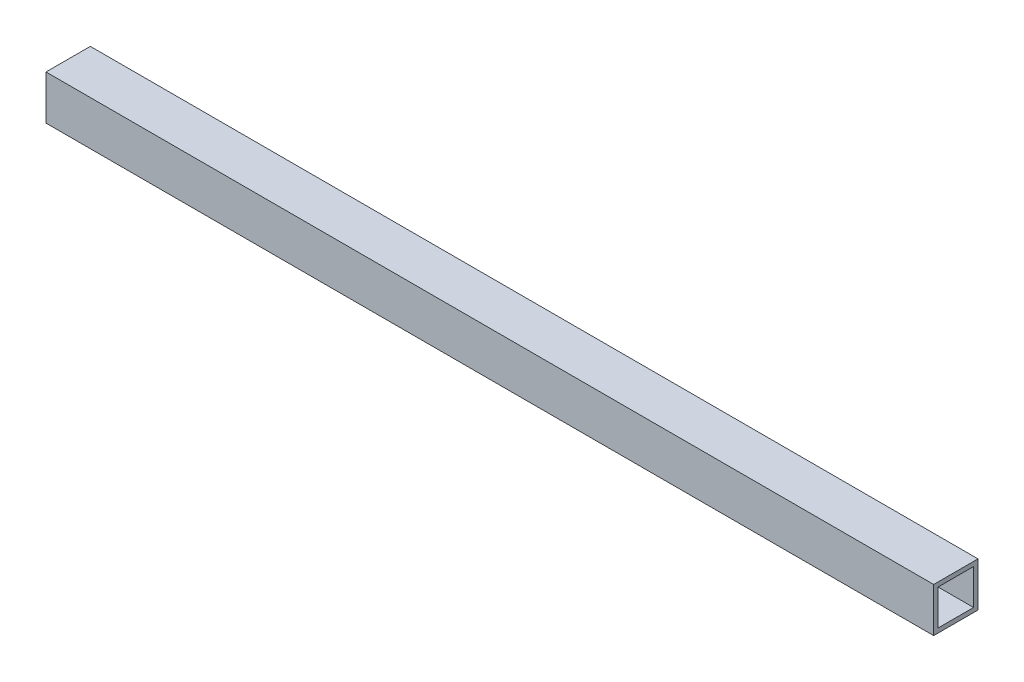
ISO-10303-21;
HEADER;
FILE_DESCRIPTION(('STEP AP214'),'2;1');
FILE_NAME('part.step','',(''),(''),'','','');
FILE_SCHEMA(('AUTOMOTIVE_DESIGN { 1 0 10303 214 1 1 1 1 }'));
ENDSEC;
DATA;
#1=APPLICATION_CONTEXT('core data for automotive mechanical design processes');
#2=APPLICATION_PROTOCOL_DEFINITION('international standard','automotive_design',2000,#1);
#3=PRODUCT_CONTEXT('',#1,'mechanical');
#4=PRODUCT('Part','Part','',(#3));
#5=PRODUCT_RELATED_PRODUCT_CATEGORY('part','',(#4));
#6=PRODUCT_DEFINITION_FORMATION('','',#4);
#7=PRODUCT_DEFINITION_CONTEXT('part definition',#1,'design');
#8=PRODUCT_DEFINITION('design','',#6,#7);
#9=PRODUCT_DEFINITION_SHAPE('','',#8);
#10=(LENGTH_UNIT() NAMED_UNIT(*) SI_UNIT(.MILLI.,.METRE.));
#11=(NAMED_UNIT(*) PLANE_ANGLE_UNIT() SI_UNIT($,.RADIAN.));
#12=(NAMED_UNIT(*) SI_UNIT($,.STERADIAN.) SOLID_ANGLE_UNIT());
#13=UNCERTAINTY_MEASURE_WITH_UNIT(LENGTH_MEASURE(1.E-05),#10,'distance_accuracy_value','');
#14=(GEOMETRIC_REPRESENTATION_CONTEXT(3) GLOBAL_UNCERTAINTY_ASSIGNED_CONTEXT((#13)) GLOBAL_UNIT_ASSIGNED_CONTEXT((#10,
#11,#12)) REPRESENTATION_CONTEXT('',''));
#15=CARTESIAN_POINT('',(0.,0.,0.));
#16=DIRECTION('',(0.,0.,1.));
#17=DIRECTION('',(1.,0.,0.));
#18=AXIS2_PLACEMENT_3D('',#15,#16,#17);
#19=CARTESIAN_POINT('',(400.5,-10.,-10.));
#20=DIRECTION('',(0.,1.,0.));
#21=DIRECTION('',(0.,0.,1.));
#22=AXIS2_PLACEMENT_3D('',#19,#20,#21);
#23=PLANE('',#22);
#24=DIRECTION('',(0.,0.,-1.));
#25=VECTOR('',#24,1.);
#26=CARTESIAN_POINT('',(0.,-10.,-10.));
#27=LINE('',#26,#25);
#28=CARTESIAN_POINT('',(0.,-10.,10.));
#29=VERTEX_POINT('',#28);
#30=CARTESIAN_POINT('',(0.,-10.,-10.));
#31=VERTEX_POINT('',#30);
#32=EDGE_CURVE('E157',#29,#31,#27,.T.);
#33=ORIENTED_EDGE('',*,*,#32,.T.);
#34=DIRECTION('',(-1.,0.,0.));
#35=VECTOR('',#34,1.);
#36=CARTESIAN_POINT('',(400.5,-10.,-10.));
#37=LINE('',#36,#35);
#38=CARTESIAN_POINT('',(400.5,-10.,-10.));
#39=VERTEX_POINT('',#38);
#40=EDGE_CURVE('E12',#39,#31,#37,.T.);
#41=ORIENTED_EDGE('',*,*,#40,.F.);
#42=DIRECTION('',(0.,0.,-1.));
#43=VECTOR('',#42,1.);
#44=CARTESIAN_POINT('',(400.5,-10.,-10.));
#45=LINE('',#44,#43);
#46=CARTESIAN_POINT('',(400.5,-10.,10.));
#47=VERTEX_POINT('',#46);
#48=EDGE_CURVE('E131',#47,#39,#45,.T.);
#49=ORIENTED_EDGE('',*,*,#48,.F.);
#50=DIRECTION('',(-1.,0.,0.));
#51=VECTOR('',#50,1.);
#52=CARTESIAN_POINT('',(400.5,-10.,10.));
#53=LINE('',#52,#51);
#54=EDGE_CURVE('E164',#47,#29,#53,.T.);
#55=ORIENTED_EDGE('',*,*,#54,.T.);
#56=EDGE_LOOP('',(#33,#41,#49,#55));
#57=FACE_BOUND('',#56,.T.);
#58=ADVANCED_FACE('F50',(#57),#23,.F.);
#59=CARTESIAN_POINT('',(400.5,10.,-10.));
#60=DIRECTION('',(0.,0.,1.));
#61=DIRECTION('',(1.,0.,0.));
#62=AXIS2_PLACEMENT_3D('',#59,#60,#61);
#63=PLANE('',#62);
#64=DIRECTION('',(0.,1.,0.));
#65=VECTOR('',#64,1.);
#66=CARTESIAN_POINT('',(0.,10.,-10.));
#67=LINE('',#66,#65);
#68=CARTESIAN_POINT('',(0.,10.,-10.));
#69=VERTEX_POINT('',#68);
#70=EDGE_CURVE('E136',#31,#69,#67,.T.);
#71=ORIENTED_EDGE('',*,*,#70,.T.);
#72=DIRECTION('',(-1.,0.,0.));
#73=VECTOR('',#72,1.);
#74=CARTESIAN_POINT('',(400.5,10.,-10.));
#75=LINE('',#74,#73);
#76=CARTESIAN_POINT('',(400.5,10.,-10.));
#77=VERTEX_POINT('',#76);
#78=EDGE_CURVE('E60',#77,#69,#75,.T.);
#79=ORIENTED_EDGE('',*,*,#78,.F.);
#80=DIRECTION('',(0.,1.,0.));
#81=VECTOR('',#80,1.);
#82=CARTESIAN_POINT('',(400.5,10.,-10.));
#83=LINE('',#82,#81);
#84=EDGE_CURVE('E125',#39,#77,#83,.T.);
#85=ORIENTED_EDGE('',*,*,#84,.F.);
#86=ORIENTED_EDGE('',*,*,#40,.T.);
#87=EDGE_LOOP('',(#71,#79,#85,#86));
#88=FACE_BOUND('',#87,.T.);
#89=ADVANCED_FACE('F135',(#88),#63,.F.);
#90=CARTESIAN_POINT('',(400.5,10.,-10.));
#91=DIRECTION('',(0.,-1.,0.));
#92=DIRECTION('',(0.,0.,-1.));
#93=AXIS2_PLACEMENT_3D('',#90,#91,#92);
#94=PLANE('',#93);
#95=DIRECTION('',(0.,0.,1.));
#96=VECTOR('',#95,1.);
#97=CARTESIAN_POINT('',(0.,10.,-10.));
#98=LINE('',#97,#96);
#99=CARTESIAN_POINT('',(0.,10.,10.));
#100=VERTEX_POINT('',#99);
#101=EDGE_CURVE('E98',#69,#100,#98,.T.);
#102=ORIENTED_EDGE('',*,*,#101,.T.);
#103=DIRECTION('',(-1.,0.,0.));
#104=VECTOR('',#103,1.);
#105=CARTESIAN_POINT('',(400.5,10.,10.));
#106=LINE('',#105,#104);
#107=CARTESIAN_POINT('',(400.5,10.,10.));
#108=VERTEX_POINT('',#107);
#109=EDGE_CURVE('E137',#108,#100,#106,.T.);
#110=ORIENTED_EDGE('',*,*,#109,.F.);
#111=DIRECTION('',(0.,0.,1.));
#112=VECTOR('',#111,1.);
#113=CARTESIAN_POINT('',(400.5,10.,-10.));
#114=LINE('',#113,#112);
#115=EDGE_CURVE('E129',#77,#108,#114,.T.);
#116=ORIENTED_EDGE('',*,*,#115,.F.);
#117=ORIENTED_EDGE('',*,*,#78,.T.);
#118=EDGE_LOOP('',(#102,#110,#116,#117));
#119=FACE_BOUND('',#118,.T.);
#120=ADVANCED_FACE('F139',(#119),#94,.F.);
#121=CARTESIAN_POINT('',(400.5,-8.,-8.));
#122=DIRECTION('',(0.,1.,0.));
#123=DIRECTION('',(0.,0.,1.));
#124=AXIS2_PLACEMENT_3D('',#121,#122,#123);
#125=PLANE('',#124);
#126=DIRECTION('',(0.,0.,-1.));
#127=VECTOR('',#126,1.);
#128=CARTESIAN_POINT('',(0.,-8.,-8.));
#129=LINE('',#128,#127);
#130=CARTESIAN_POINT('',(0.,-8.,8.));
#131=VERTEX_POINT('',#130);
#132=CARTESIAN_POINT('',(0.,-8.,-8.));
#133=VERTEX_POINT('',#132);
#134=EDGE_CURVE('E145',#131,#133,#129,.T.);
#135=ORIENTED_EDGE('',*,*,#134,.F.);
#136=DIRECTION('',(-1.,0.,0.));
#137=VECTOR('',#136,1.);
#138=CARTESIAN_POINT('',(400.5,-8.,8.));
#139=LINE('',#138,#137);
#140=CARTESIAN_POINT('',(400.5,-8.,8.));
#141=VERTEX_POINT('',#140);
#142=EDGE_CURVE('E54',#141,#131,#139,.T.);
#143=ORIENTED_EDGE('',*,*,#142,.F.);
#144=DIRECTION('',(0.,0.,-1.));
#145=VECTOR('',#144,1.);
#146=CARTESIAN_POINT('',(400.5,-8.,-8.));
#147=LINE('',#146,#145);
#148=CARTESIAN_POINT('',(400.5,-8.,-8.));
#149=VERTEX_POINT('',#148);
#150=EDGE_CURVE('E163',#141,#149,#147,.T.);
#151=ORIENTED_EDGE('',*,*,#150,.T.);
#152=DIRECTION('',(-1.,0.,0.));
#153=VECTOR('',#152,1.);
#154=CARTESIAN_POINT('',(400.5,-8.,-8.));
#155=LINE('',#154,#153);
#156=EDGE_CURVE('E141',#149,#133,#155,.T.);
#157=ORIENTED_EDGE('',*,*,#156,.T.);
#158=EDGE_LOOP('',(#135,#143,#151,#157));
#159=FACE_BOUND('',#158,.T.);
#160=ADVANCED_FACE('F52',(#159),#125,.T.);
#161=CARTESIAN_POINT('',(400.5,8.,8.));
#162=DIRECTION('',(0.,0.,-1.));
#163=DIRECTION('',(-1.,0.,0.));
#164=AXIS2_PLACEMENT_3D('',#161,#162,#163);
#165=PLANE('',#164);
#166=DIRECTION('',(0.,-1.,0.));
#167=VECTOR('',#166,1.);
#168=CARTESIAN_POINT('',(0.,8.,8.));
#169=LINE('',#168,#167);
#170=CARTESIAN_POINT('',(0.,8.,8.));
#171=VERTEX_POINT('',#170);
#172=EDGE_CURVE('E148',#171,#131,#169,.T.);
#173=ORIENTED_EDGE('',*,*,#172,.F.);
#174=DIRECTION('',(-1.,0.,0.));
#175=VECTOR('',#174,1.);
#176=CARTESIAN_POINT('',(400.5,8.,8.));
#177=LINE('',#176,#175);
#178=CARTESIAN_POINT('',(400.5,8.,8.));
#179=VERTEX_POINT('',#178);
#180=EDGE_CURVE('E169',#179,#171,#177,.T.);
#181=ORIENTED_EDGE('',*,*,#180,.F.);
#182=DIRECTION('',(0.,-1.,0.));
#183=VECTOR('',#182,1.);
#184=CARTESIAN_POINT('',(400.5,8.,8.));
#185=LINE('',#184,#183);
#186=EDGE_CURVE('E178',#179,#141,#185,.T.);
#187=ORIENTED_EDGE('',*,*,#186,.T.);
#188=ORIENTED_EDGE('',*,*,#142,.T.);
#189=EDGE_LOOP('',(#173,#181,#187,#188));
#190=FACE_BOUND('',#189,.T.);
#191=ADVANCED_FACE('F176',(#190),#165,.T.);
#192=CARTESIAN_POINT('',(400.5,8.,-8.));
#193=DIRECTION('',(0.,-1.,0.));
#194=DIRECTION('',(0.,0.,-1.));
#195=AXIS2_PLACEMENT_3D('',#192,#193,#194);
#196=PLANE('',#195);
#197=DIRECTION('',(0.,0.,1.));
#198=VECTOR('',#197,1.);
#199=CARTESIAN_POINT('',(0.,8.,-8.));
#200=LINE('',#199,#198);
#201=CARTESIAN_POINT('',(0.,8.,-8.));
#202=VERTEX_POINT('',#201);
#203=EDGE_CURVE('E151',#202,#171,#200,.T.);
#204=ORIENTED_EDGE('',*,*,#203,.F.);
#205=DIRECTION('',(-1.,0.,0.));
#206=VECTOR('',#205,1.);
#207=CARTESIAN_POINT('',(400.5,8.,-8.));
#208=LINE('',#207,#206);
#209=CARTESIAN_POINT('',(400.5,8.,-8.));
#210=VERTEX_POINT('',#209);
#211=EDGE_CURVE('E168',#210,#202,#208,.T.);
#212=ORIENTED_EDGE('',*,*,#211,.F.);
#213=DIRECTION('',(0.,0.,1.));
#214=VECTOR('',#213,1.);
#215=CARTESIAN_POINT('',(400.5,8.,-8.));
#216=LINE('',#215,#214);
#217=EDGE_CURVE('E185',#210,#179,#216,.T.);
#218=ORIENTED_EDGE('',*,*,#217,.T.);
#219=ORIENTED_EDGE('',*,*,#180,.T.);
#220=EDGE_LOOP('',(#204,#212,#218,#219));
#221=FACE_BOUND('',#220,.T.);
#222=ADVANCED_FACE('F183',(#221),#196,.T.);
#223=CARTESIAN_POINT('',(400.5,8.,-8.));
#224=DIRECTION('',(0.,0.,1.));
#225=DIRECTION('',(1.,0.,0.));
#226=AXIS2_PLACEMENT_3D('',#223,#224,#225);
#227=PLANE('',#226);
#228=DIRECTION('',(0.,1.,0.));
#229=VECTOR('',#228,1.);
#230=CARTESIAN_POINT('',(0.,8.,-8.));
#231=LINE('',#230,#229);
#232=EDGE_CURVE('E154',#133,#202,#231,.T.);
#233=ORIENTED_EDGE('',*,*,#232,.F.);
#234=ORIENTED_EDGE('',*,*,#156,.F.);
#235=DIRECTION('',(0.,1.,0.));
#236=VECTOR('',#235,1.);
#237=CARTESIAN_POINT('',(400.5,8.,-8.));
#238=LINE('',#237,#236);
#239=EDGE_CURVE('E190',#149,#210,#238,.T.);
#240=ORIENTED_EDGE('',*,*,#239,.T.);
#241=ORIENTED_EDGE('',*,*,#211,.T.);
#242=EDGE_LOOP('',(#233,#234,#240,#241));
#243=FACE_BOUND('',#242,.T.);
#244=ADVANCED_FACE('F192',(#243),#227,.T.);
#245=CARTESIAN_POINT('',(400.5,10.,10.));
#246=DIRECTION('',(0.,0.,-1.));
#247=DIRECTION('',(-1.,0.,0.));
#248=AXIS2_PLACEMENT_3D('',#245,#246,#247);
#249=PLANE('',#248);
#250=DIRECTION('',(0.,-1.,0.));
#251=VECTOR('',#250,1.);
#252=CARTESIAN_POINT('',(0.,10.,10.));
#253=LINE('',#252,#251);
#254=EDGE_CURVE('E104',#100,#29,#253,.T.);
#255=ORIENTED_EDGE('',*,*,#254,.T.);
#256=ORIENTED_EDGE('',*,*,#54,.F.);
#257=DIRECTION('',(0.,-1.,0.));
#258=VECTOR('',#257,1.);
#259=CARTESIAN_POINT('',(400.5,10.,10.));
#260=LINE('',#259,#258);
#261=EDGE_CURVE('E69',#108,#47,#260,.T.);
#262=ORIENTED_EDGE('',*,*,#261,.F.);
#263=ORIENTED_EDGE('',*,*,#109,.T.);
#264=EDGE_LOOP('',(#255,#256,#262,#263));
#265=FACE_BOUND('',#264,.T.);
#266=ADVANCED_FACE('F197',(#265),#249,.F.);
#267=CARTESIAN_POINT('',(400.5,0.,0.));
#268=DIRECTION('',(1.,0.,0.));
#269=DIRECTION('',(0.,0.,-1.));
#270=AXIS2_PLACEMENT_3D('',#267,#268,#269);
#271=PLANE('',#270);
#272=ORIENTED_EDGE('',*,*,#150,.F.);
#273=ORIENTED_EDGE('',*,*,#186,.F.);
#274=ORIENTED_EDGE('',*,*,#217,.F.);
#275=ORIENTED_EDGE('',*,*,#239,.F.);
#276=EDGE_LOOP('',(#272,#273,#274,#275));
#277=FACE_BOUND('',#276,.T.);
#278=ORIENTED_EDGE('',*,*,#48,.T.);
#279=ORIENTED_EDGE('',*,*,#84,.T.);
#280=ORIENTED_EDGE('',*,*,#115,.T.);
#281=ORIENTED_EDGE('',*,*,#261,.T.);
#282=EDGE_LOOP('',(#278,#279,#280,#281));
#283=FACE_BOUND('',#282,.T.);
#284=ADVANCED_FACE('F127',(#277,#283),#271,.T.);
#285=CARTESIAN_POINT('',(0.,0.,0.));
#286=DIRECTION('',(1.,0.,0.));
#287=DIRECTION('',(0.,0.,-1.));
#288=AXIS2_PLACEMENT_3D('',#285,#286,#287);
#289=PLANE('',#288);
#290=ORIENTED_EDGE('',*,*,#134,.T.);
#291=ORIENTED_EDGE('',*,*,#232,.T.);
#292=ORIENTED_EDGE('',*,*,#203,.T.);
#293=ORIENTED_EDGE('',*,*,#172,.T.);
#294=EDGE_LOOP('',(#290,#291,#292,#293));
#295=FACE_BOUND('',#294,.T.);
#296=ORIENTED_EDGE('',*,*,#32,.F.);
#297=ORIENTED_EDGE('',*,*,#254,.F.);
#298=ORIENTED_EDGE('',*,*,#101,.F.);
#299=ORIENTED_EDGE('',*,*,#70,.F.);
#300=EDGE_LOOP('',(#296,#297,#298,#299));
#301=FACE_BOUND('',#300,.T.);
#302=ADVANCED_FACE('F181',(#295,#301),#289,.F.);
#303=CLOSED_SHELL('',(#58,#89,#120,#160,#191,#222,#244,#266,#284,#302));
#304=MANIFOLD_SOLID_BREP('B2',#303);
#305=ADVANCED_BREP_SHAPE_REPRESENTATION('',(#18,#304),#14);
#306=SHAPE_DEFINITION_REPRESENTATION(#9,#305);
ENDSEC;
END-ISO-10303-21;
